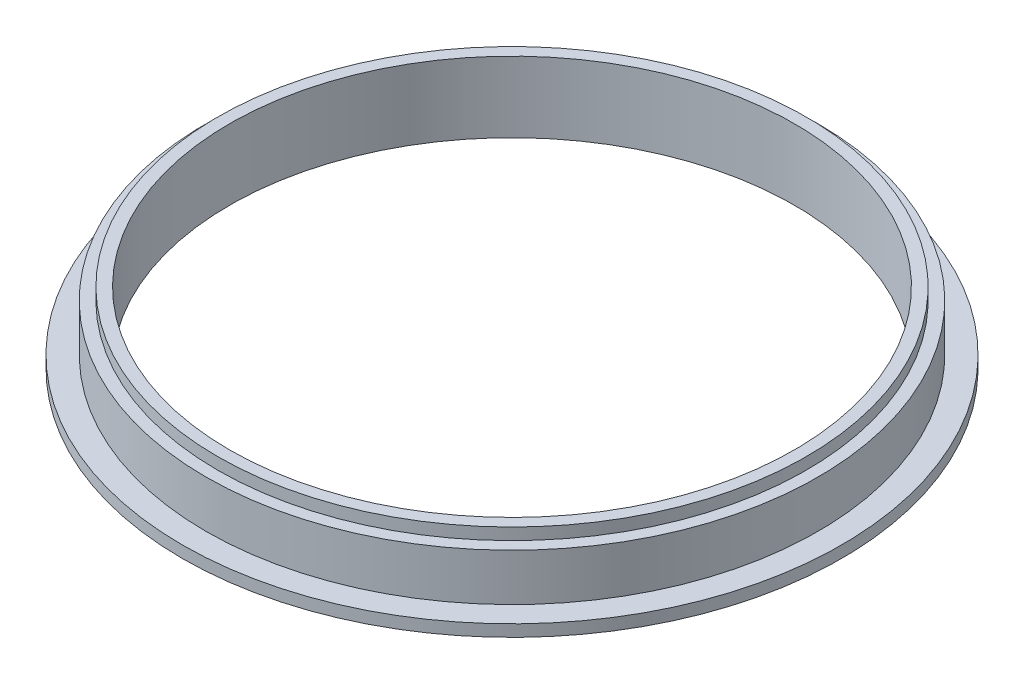
ISO-10303-21;
HEADER;
FILE_DESCRIPTION(('STEP AP214'),'2;1');
FILE_NAME('part.step','',(''),(''),'','','');
FILE_SCHEMA(('AUTOMOTIVE_DESIGN { 1 0 10303 214 1 1 1 1 }'));
ENDSEC;
DATA;
#1=APPLICATION_CONTEXT('core data for automotive mechanical design processes');
#2=APPLICATION_PROTOCOL_DEFINITION('international standard','automotive_design',2000,#1);
#3=PRODUCT_CONTEXT('',#1,'mechanical');
#4=PRODUCT('Part','Part','',(#3));
#5=PRODUCT_RELATED_PRODUCT_CATEGORY('part','',(#4));
#6=PRODUCT_DEFINITION_FORMATION('','',#4);
#7=PRODUCT_DEFINITION_CONTEXT('part definition',#1,'design');
#8=PRODUCT_DEFINITION('design','',#6,#7);
#9=PRODUCT_DEFINITION_SHAPE('','',#8);
#10=(LENGTH_UNIT() NAMED_UNIT(*) SI_UNIT(.MILLI.,.METRE.));
#11=(NAMED_UNIT(*) PLANE_ANGLE_UNIT() SI_UNIT($,.RADIAN.));
#12=(NAMED_UNIT(*) SI_UNIT($,.STERADIAN.) SOLID_ANGLE_UNIT());
#13=UNCERTAINTY_MEASURE_WITH_UNIT(LENGTH_MEASURE(1.E-05),#10,'distance_accuracy_value','');
#14=(GEOMETRIC_REPRESENTATION_CONTEXT(3) GLOBAL_UNCERTAINTY_ASSIGNED_CONTEXT((#13)) GLOBAL_UNIT_ASSIGNED_CONTEXT((#10,
#11,#12)) REPRESENTATION_CONTEXT('',''));
#15=CARTESIAN_POINT('',(0.,0.,0.));
#16=DIRECTION('',(0.,0.,1.));
#17=DIRECTION('',(1.,0.,0.));
#18=AXIS2_PLACEMENT_3D('',#15,#16,#17);
#19=CARTESIAN_POINT('',(0.,1.,0.));
#20=DIRECTION('',(0.,-1.,0.));
#21=DIRECTION('',(0.,0.,-1.));
#22=AXIS2_PLACEMENT_3D('',#19,#20,#21);
#23=CYLINDRICAL_SURFACE('',#22,28.);
#24=CARTESIAN_POINT('',(0.,1.,0.));
#25=DIRECTION('',(0.,1.,0.));
#26=DIRECTION('',(0.,0.,1.));
#27=AXIS2_PLACEMENT_3D('',#24,#25,#26);
#28=CIRCLE('',#27,28.);
#29=CARTESIAN_POINT('',(0.,1.,28.));
#30=VERTEX_POINT('',#29);
#31=EDGE_CURVE('E10',#30,#30,#28,.T.);
#32=ORIENTED_EDGE('',*,*,#31,.F.);
#33=EDGE_LOOP('',(#32));
#34=FACE_BOUND('',#33,.T.);
#35=CARTESIAN_POINT('',(0.,0.,0.));
#36=DIRECTION('',(0.,1.,0.));
#37=DIRECTION('',(0.,0.,1.));
#38=AXIS2_PLACEMENT_3D('',#35,#36,#37);
#39=CIRCLE('',#38,28.);
#40=CARTESIAN_POINT('',(0.,0.,28.));
#41=VERTEX_POINT('',#40);
#42=EDGE_CURVE('E34',#41,#41,#39,.T.);
#43=ORIENTED_EDGE('',*,*,#42,.T.);
#44=EDGE_LOOP('',(#43));
#45=FACE_BOUND('',#44,.T.);
#46=ADVANCED_FACE('F31',(#34,#45),#23,.T.);
#47=CARTESIAN_POINT('',(0.,1.,0.));
#48=DIRECTION('',(0.,1.,0.));
#49=DIRECTION('',(0.,0.,1.));
#50=AXIS2_PLACEMENT_3D('',#47,#48,#49);
#51=PLANE('',#50);
#52=CARTESIAN_POINT('',(0.,1.,0.));
#53=DIRECTION('',(0.,1.,0.));
#54=DIRECTION('',(0.,0.,1.));
#55=AXIS2_PLACEMENT_3D('',#52,#53,#54);
#56=CIRCLE('',#55,26.);
#57=CARTESIAN_POINT('',(0.,1.,26.));
#58=VERTEX_POINT('',#57);
#59=EDGE_CURVE('E43',#58,#58,#56,.T.);
#60=ORIENTED_EDGE('',*,*,#59,.F.);
#61=EDGE_LOOP('',(#60));
#62=FACE_BOUND('',#61,.T.);
#63=ORIENTED_EDGE('',*,*,#31,.T.);
#64=EDGE_LOOP('',(#63));
#65=FACE_BOUND('',#64,.T.);
#66=ADVANCED_FACE('F78',(#62,#65),#51,.T.);
#67=CARTESIAN_POINT('',(0.,0.,0.));
#68=DIRECTION('',(0.,1.,0.));
#69=DIRECTION('',(0.,0.,1.));
#70=AXIS2_PLACEMENT_3D('',#67,#68,#69);
#71=PLANE('',#70);
#72=CARTESIAN_POINT('',(0.,0.,0.));
#73=DIRECTION('',(0.,1.,0.));
#74=DIRECTION('',(0.,0.,1.));
#75=AXIS2_PLACEMENT_3D('',#72,#73,#74);
#76=CIRCLE('',#75,24.);
#77=CARTESIAN_POINT('',(0.,0.,24.));
#78=VERTEX_POINT('',#77);
#79=EDGE_CURVE('E52',#78,#78,#76,.T.);
#80=ORIENTED_EDGE('',*,*,#79,.T.);
#81=EDGE_LOOP('',(#80));
#82=FACE_BOUND('',#81,.T.);
#83=ORIENTED_EDGE('',*,*,#42,.F.);
#84=EDGE_LOOP('',(#83));
#85=FACE_BOUND('',#84,.T.);
#86=ADVANCED_FACE('F61',(#82,#85),#71,.F.);
#87=CARTESIAN_POINT('',(0.,5.,0.));
#88=DIRECTION('',(0.,1.,0.));
#89=DIRECTION('',(0.,0.,1.));
#90=AXIS2_PLACEMENT_3D('',#87,#88,#89);
#91=PLANE('',#90);
#92=CARTESIAN_POINT('',(0.,5.,0.));
#93=DIRECTION('',(0.,1.,0.));
#94=DIRECTION('',(0.,0.,1.));
#95=AXIS2_PLACEMENT_3D('',#92,#93,#94);
#96=CIRCLE('',#95,25.);
#97=CARTESIAN_POINT('',(0.,5.,25.));
#98=VERTEX_POINT('',#97);
#99=EDGE_CURVE('E49',#98,#98,#96,.T.);
#100=ORIENTED_EDGE('',*,*,#99,.F.);
#101=EDGE_LOOP('',(#100));
#102=FACE_BOUND('',#101,.T.);
#103=CARTESIAN_POINT('',(0.,5.,0.));
#104=DIRECTION('',(0.,1.,0.));
#105=DIRECTION('',(0.,0.,1.));
#106=AXIS2_PLACEMENT_3D('',#103,#104,#105);
#107=CIRCLE('',#106,26.);
#108=CARTESIAN_POINT('',(0.,5.,26.));
#109=VERTEX_POINT('',#108);
#110=EDGE_CURVE('E41',#109,#109,#107,.T.);
#111=ORIENTED_EDGE('',*,*,#110,.T.);
#112=EDGE_LOOP('',(#111));
#113=FACE_BOUND('',#112,.T.);
#114=ADVANCED_FACE('F88',(#102,#113),#91,.T.);
#115=CARTESIAN_POINT('',(0.,5.,0.));
#116=DIRECTION('',(0.,-1.,0.));
#117=DIRECTION('',(0.,0.,-1.));
#118=AXIS2_PLACEMENT_3D('',#115,#116,#117);
#119=CYLINDRICAL_SURFACE('',#118,26.);
#120=ORIENTED_EDGE('',*,*,#110,.F.);
#121=EDGE_LOOP('',(#120));
#122=FACE_BOUND('',#121,.T.);
#123=ORIENTED_EDGE('',*,*,#59,.T.);
#124=EDGE_LOOP('',(#123));
#125=FACE_BOUND('',#124,.T.);
#126=ADVANCED_FACE('F92',(#122,#125),#119,.T.);
#127=CARTESIAN_POINT('',(0.,6.,0.));
#128=DIRECTION('',(0.,-1.,0.));
#129=DIRECTION('',(0.,0.,-1.));
#130=AXIS2_PLACEMENT_3D('',#127,#128,#129);
#131=CYLINDRICAL_SURFACE('',#130,25.);
#132=CARTESIAN_POINT('',(0.,6.,0.));
#133=DIRECTION('',(0.,1.,0.));
#134=DIRECTION('',(0.,0.,1.));
#135=AXIS2_PLACEMENT_3D('',#132,#133,#134);
#136=CIRCLE('',#135,25.);
#137=CARTESIAN_POINT('',(0.,6.,25.));
#138=VERTEX_POINT('',#137);
#139=EDGE_CURVE('E46',#138,#138,#136,.T.);
#140=ORIENTED_EDGE('',*,*,#139,.F.);
#141=EDGE_LOOP('',(#140));
#142=FACE_BOUND('',#141,.T.);
#143=ORIENTED_EDGE('',*,*,#99,.T.);
#144=EDGE_LOOP('',(#143));
#145=FACE_BOUND('',#144,.T.);
#146=ADVANCED_FACE('F72',(#142,#145),#131,.T.);
#147=CARTESIAN_POINT('',(0.,6.,0.));
#148=DIRECTION('',(0.,1.,0.));
#149=DIRECTION('',(0.,0.,1.));
#150=AXIS2_PLACEMENT_3D('',#147,#148,#149);
#151=PLANE('',#150);
#152=CARTESIAN_POINT('',(0.,6.,0.));
#153=DIRECTION('',(0.,1.,0.));
#154=DIRECTION('',(0.,0.,1.));
#155=AXIS2_PLACEMENT_3D('',#152,#153,#154);
#156=CIRCLE('',#155,24.);
#157=CARTESIAN_POINT('',(0.,6.,24.));
#158=VERTEX_POINT('',#157);
#159=EDGE_CURVE('E55',#158,#158,#156,.T.);
#160=ORIENTED_EDGE('',*,*,#159,.F.);
#161=EDGE_LOOP('',(#160));
#162=FACE_BOUND('',#161,.T.);
#163=ORIENTED_EDGE('',*,*,#139,.T.);
#164=EDGE_LOOP('',(#163));
#165=FACE_BOUND('',#164,.T.);
#166=ADVANCED_FACE('F66',(#162,#165),#151,.T.);
#167=CARTESIAN_POINT('',(0.,5.,0.));
#168=DIRECTION('',(0.,-1.,0.));
#169=DIRECTION('',(0.,0.,-1.));
#170=AXIS2_PLACEMENT_3D('',#167,#168,#169);
#171=CYLINDRICAL_SURFACE('',#170,24.);
#172=ORIENTED_EDGE('',*,*,#159,.T.);
#173=EDGE_LOOP('',(#172));
#174=FACE_BOUND('',#173,.T.);
#175=ORIENTED_EDGE('',*,*,#79,.F.);
#176=EDGE_LOOP('',(#175));
#177=FACE_BOUND('',#176,.T.);
#178=ADVANCED_FACE('F64',(#174,#177),#171,.F.);
#179=CLOSED_SHELL('',(#46,#66,#86,#114,#126,#146,#166,#178));
#180=MANIFOLD_SOLID_BREP('B2',#179);
#181=ADVANCED_BREP_SHAPE_REPRESENTATION('',(#18,#180),#14);
#182=SHAPE_DEFINITION_REPRESENTATION(#9,#181);
ENDSEC;
END-ISO-10303-21;
